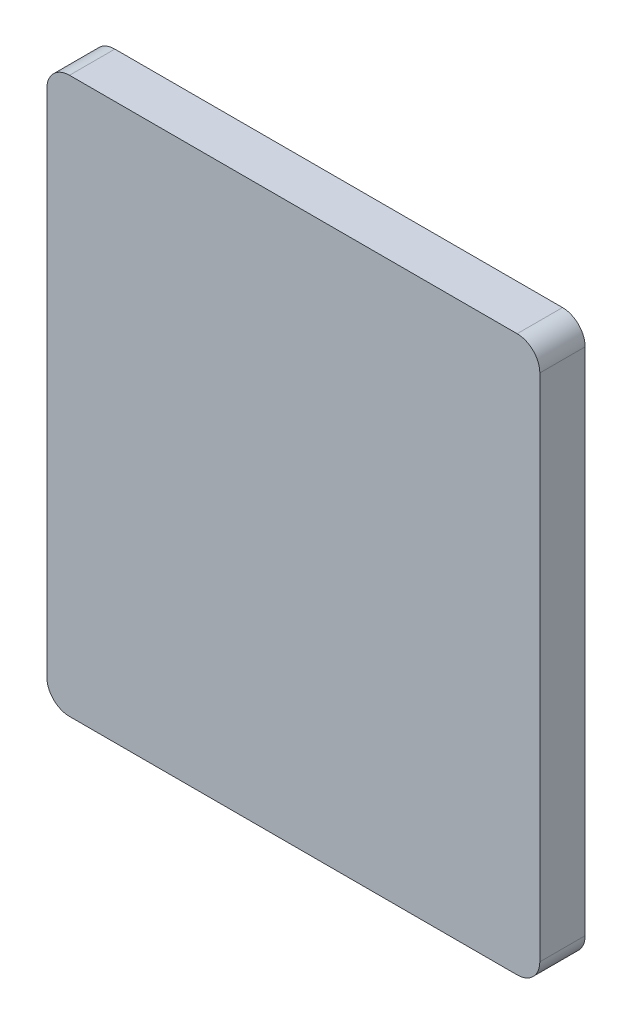
ISO-10303-21;
HEADER;
FILE_DESCRIPTION(('STEP AP214'),'2;1');
FILE_NAME('part.step','',(''),(''),'','','');
FILE_SCHEMA(('AUTOMOTIVE_DESIGN { 1 0 10303 214 1 1 1 1 }'));
ENDSEC;
DATA;
#1=APPLICATION_CONTEXT('core data for automotive mechanical design processes');
#2=APPLICATION_PROTOCOL_DEFINITION('international standard','automotive_design',2000,#1);
#3=PRODUCT_CONTEXT('',#1,'mechanical');
#4=PRODUCT('Part','Part','',(#3));
#5=PRODUCT_RELATED_PRODUCT_CATEGORY('part','',(#4));
#6=PRODUCT_DEFINITION_FORMATION('','',#4);
#7=PRODUCT_DEFINITION_CONTEXT('part definition',#1,'design');
#8=PRODUCT_DEFINITION('design','',#6,#7);
#9=PRODUCT_DEFINITION_SHAPE('','',#8);
#10=(LENGTH_UNIT() NAMED_UNIT(*) SI_UNIT(.MILLI.,.METRE.));
#11=(NAMED_UNIT(*) PLANE_ANGLE_UNIT() SI_UNIT($,.RADIAN.));
#12=(NAMED_UNIT(*) SI_UNIT($,.STERADIAN.) SOLID_ANGLE_UNIT());
#13=UNCERTAINTY_MEASURE_WITH_UNIT(LENGTH_MEASURE(1.E-05),#10,'distance_accuracy_value','');
#14=(GEOMETRIC_REPRESENTATION_CONTEXT(3) GLOBAL_UNCERTAINTY_ASSIGNED_CONTEXT((#13)) GLOBAL_UNIT_ASSIGNED_CONTEXT((#10,
#11,#12)) REPRESENTATION_CONTEXT('',''));
#15=CARTESIAN_POINT('',(0.,0.,0.));
#16=DIRECTION('',(0.,0.,1.));
#17=DIRECTION('',(1.,0.,0.));
#18=AXIS2_PLACEMENT_3D('',#15,#16,#17);
#19=CARTESIAN_POINT('',(39.5,45.,8.));
#20=DIRECTION('',(0.,0.,-1.));
#21=DIRECTION('',(-1.,0.,0.));
#22=AXIS2_PLACEMENT_3D('',#19,#20,#21);
#23=CYLINDRICAL_SURFACE('',#22,4.);
#24=CARTESIAN_POINT('',(39.5,45.,0.));
#25=DIRECTION('',(0.,0.,1.));
#26=DIRECTION('',(1.,0.,0.));
#27=AXIS2_PLACEMENT_3D('',#24,#25,#26);
#28=CIRCLE('',#27,4.);
#29=CARTESIAN_POINT('',(43.5,45.,0.));
#30=VERTEX_POINT('',#29);
#31=CARTESIAN_POINT('',(39.5,49.,0.));
#32=VERTEX_POINT('',#31);
#33=EDGE_CURVE('E128',#30,#32,#28,.T.);
#34=ORIENTED_EDGE('',*,*,#33,.T.);
#35=DIRECTION('',(0.,0.,-1.));
#36=VECTOR('',#35,1.);
#37=CARTESIAN_POINT('',(39.5,49.,8.));
#38=LINE('',#37,#36);
#39=CARTESIAN_POINT('',(39.5,49.,8.));
#40=VERTEX_POINT('',#39);
#41=EDGE_CURVE('E11',#40,#32,#38,.T.);
#42=ORIENTED_EDGE('',*,*,#41,.F.);
#43=CARTESIAN_POINT('',(39.5,45.,8.));
#44=DIRECTION('',(0.,0.,1.));
#45=DIRECTION('',(1.,0.,0.));
#46=AXIS2_PLACEMENT_3D('',#43,#44,#45);
#47=CIRCLE('',#46,4.);
#48=CARTESIAN_POINT('',(43.5,45.,8.));
#49=VERTEX_POINT('',#48);
#50=EDGE_CURVE('E142',#49,#40,#47,.T.);
#51=ORIENTED_EDGE('',*,*,#50,.F.);
#52=DIRECTION('',(0.,0.,-1.));
#53=VECTOR('',#52,1.);
#54=CARTESIAN_POINT('',(43.5,45.,8.));
#55=LINE('',#54,#53);
#56=EDGE_CURVE('E124',#49,#30,#55,.T.);
#57=ORIENTED_EDGE('',*,*,#56,.T.);
#58=EDGE_LOOP('',(#34,#42,#51,#57));
#59=FACE_BOUND('',#58,.T.);
#60=ADVANCED_FACE('F32',(#59),#23,.T.);
#61=CARTESIAN_POINT('',(39.5,49.,8.));
#62=DIRECTION('',(0.,-1.,0.));
#63=DIRECTION('',(1.,0.,0.));
#64=AXIS2_PLACEMENT_3D('',#61,#62,#63);
#65=PLANE('',#64);
#66=DIRECTION('',(-1.,0.,0.));
#67=VECTOR('',#66,1.);
#68=CARTESIAN_POINT('',(39.5,49.,0.));
#69=LINE('',#68,#67);
#70=CARTESIAN_POINT('',(-39.5,49.,0.));
#71=VERTEX_POINT('',#70);
#72=EDGE_CURVE('E131',#32,#71,#69,.T.);
#73=ORIENTED_EDGE('',*,*,#72,.T.);
#74=DIRECTION('',(0.,0.,-1.));
#75=VECTOR('',#74,1.);
#76=CARTESIAN_POINT('',(-39.5,49.,8.));
#77=LINE('',#76,#75);
#78=CARTESIAN_POINT('',(-39.5,49.,8.));
#79=VERTEX_POINT('',#78);
#80=EDGE_CURVE('E40',#79,#71,#77,.T.);
#81=ORIENTED_EDGE('',*,*,#80,.F.);
#82=DIRECTION('',(-1.,0.,0.));
#83=VECTOR('',#82,1.);
#84=CARTESIAN_POINT('',(39.5,49.,8.));
#85=LINE('',#84,#83);
#86=EDGE_CURVE('E91',#40,#79,#85,.T.);
#87=ORIENTED_EDGE('',*,*,#86,.F.);
#88=ORIENTED_EDGE('',*,*,#41,.T.);
#89=EDGE_LOOP('',(#73,#81,#87,#88));
#90=FACE_BOUND('',#89,.T.);
#91=ADVANCED_FACE('F177',(#90),#65,.F.);
#92=CARTESIAN_POINT('',(-39.5,45.,8.));
#93=DIRECTION('',(0.,0.,-1.));
#94=DIRECTION('',(-1.,0.,0.));
#95=AXIS2_PLACEMENT_3D('',#92,#93,#94);
#96=CYLINDRICAL_SURFACE('',#95,4.);
#97=CARTESIAN_POINT('',(-39.5,45.,0.));
#98=DIRECTION('',(0.,0.,1.));
#99=DIRECTION('',(-1.,0.,0.));
#100=AXIS2_PLACEMENT_3D('',#97,#98,#99);
#101=CIRCLE('',#100,4.);
#102=CARTESIAN_POINT('',(-43.5,45.,0.));
#103=VERTEX_POINT('',#102);
#104=EDGE_CURVE('E133',#71,#103,#101,.T.);
#105=ORIENTED_EDGE('',*,*,#104,.T.);
#106=DIRECTION('',(0.,0.,-1.));
#107=VECTOR('',#106,1.);
#108=CARTESIAN_POINT('',(-43.5,45.,8.));
#109=LINE('',#108,#107);
#110=CARTESIAN_POINT('',(-43.5,45.,8.));
#111=VERTEX_POINT('',#110);
#112=EDGE_CURVE('E149',#111,#103,#109,.T.);
#113=ORIENTED_EDGE('',*,*,#112,.F.);
#114=CARTESIAN_POINT('',(-39.5,45.,8.));
#115=DIRECTION('',(0.,0.,1.));
#116=DIRECTION('',(-1.,0.,0.));
#117=AXIS2_PLACEMENT_3D('',#114,#115,#116);
#118=CIRCLE('',#117,4.);
#119=EDGE_CURVE('E157',#79,#111,#118,.T.);
#120=ORIENTED_EDGE('',*,*,#119,.F.);
#121=ORIENTED_EDGE('',*,*,#80,.T.);
#122=EDGE_LOOP('',(#105,#113,#120,#121));
#123=FACE_BOUND('',#122,.T.);
#124=ADVANCED_FACE('F155',(#123),#96,.T.);
#125=CARTESIAN_POINT('',(-43.5,-45.,8.));
#126=DIRECTION('',(1.,0.,0.));
#127=DIRECTION('',(0.,0.,-1.));
#128=AXIS2_PLACEMENT_3D('',#125,#126,#127);
#129=PLANE('',#128);
#130=DIRECTION('',(0.,-1.,0.));
#131=VECTOR('',#130,1.);
#132=CARTESIAN_POINT('',(-43.5,-45.,0.));
#133=LINE('',#132,#131);
#134=CARTESIAN_POINT('',(-43.5,-45.,0.));
#135=VERTEX_POINT('',#134);
#136=EDGE_CURVE('E135',#103,#135,#133,.T.);
#137=ORIENTED_EDGE('',*,*,#136,.T.);
#138=DIRECTION('',(0.,0.,-1.));
#139=VECTOR('',#138,1.);
#140=CARTESIAN_POINT('',(-43.5,-45.,8.));
#141=LINE('',#140,#139);
#142=CARTESIAN_POINT('',(-43.5,-45.,8.));
#143=VERTEX_POINT('',#142);
#144=EDGE_CURVE('E146',#143,#135,#141,.T.);
#145=ORIENTED_EDGE('',*,*,#144,.F.);
#146=DIRECTION('',(0.,-1.,0.));
#147=VECTOR('',#146,1.);
#148=CARTESIAN_POINT('',(-43.5,-45.,8.));
#149=LINE('',#148,#147);
#150=EDGE_CURVE('E169',#111,#143,#149,.T.);
#151=ORIENTED_EDGE('',*,*,#150,.F.);
#152=ORIENTED_EDGE('',*,*,#112,.T.);
#153=EDGE_LOOP('',(#137,#145,#151,#152));
#154=FACE_BOUND('',#153,.T.);
#155=ADVANCED_FACE('F165',(#154),#129,.F.);
#156=CARTESIAN_POINT('',(-39.5,-45.,8.));
#157=DIRECTION('',(0.,0.,-1.));
#158=DIRECTION('',(-1.,0.,0.));
#159=AXIS2_PLACEMENT_3D('',#156,#157,#158);
#160=CYLINDRICAL_SURFACE('',#159,4.);
#161=CARTESIAN_POINT('',(-39.5,-45.,0.));
#162=DIRECTION('',(0.,0.,1.));
#163=DIRECTION('',(1.,0.,0.));
#164=AXIS2_PLACEMENT_3D('',#161,#162,#163);
#165=CIRCLE('',#164,4.);
#166=CARTESIAN_POINT('',(-39.5,-49.,0.));
#167=VERTEX_POINT('',#166);
#168=EDGE_CURVE('E137',#135,#167,#165,.T.);
#169=ORIENTED_EDGE('',*,*,#168,.T.);
#170=DIRECTION('',(0.,0.,-1.));
#171=VECTOR('',#170,1.);
#172=CARTESIAN_POINT('',(-39.5,-49.,8.));
#173=LINE('',#172,#171);
#174=CARTESIAN_POINT('',(-39.5,-49.,8.));
#175=VERTEX_POINT('',#174);
#176=EDGE_CURVE('E119',#175,#167,#173,.T.);
#177=ORIENTED_EDGE('',*,*,#176,.F.);
#178=CARTESIAN_POINT('',(-39.5,-45.,8.));
#179=DIRECTION('',(0.,0.,1.));
#180=DIRECTION('',(1.,0.,0.));
#181=AXIS2_PLACEMENT_3D('',#178,#179,#180);
#182=CIRCLE('',#181,4.);
#183=EDGE_CURVE('E110',#143,#175,#182,.T.);
#184=ORIENTED_EDGE('',*,*,#183,.F.);
#185=ORIENTED_EDGE('',*,*,#144,.T.);
#186=EDGE_LOOP('',(#169,#177,#184,#185));
#187=FACE_BOUND('',#186,.T.);
#188=ADVANCED_FACE('F168',(#187),#160,.T.);
#189=CARTESIAN_POINT('',(39.5,-49.,8.));
#190=DIRECTION('',(0.,1.,0.));
#191=DIRECTION('',(-1.,0.,0.));
#192=AXIS2_PLACEMENT_3D('',#189,#190,#191);
#193=PLANE('',#192);
#194=DIRECTION('',(1.,0.,0.));
#195=VECTOR('',#194,1.);
#196=CARTESIAN_POINT('',(39.5,-49.,0.));
#197=LINE('',#196,#195);
#198=CARTESIAN_POINT('',(39.5,-49.,0.));
#199=VERTEX_POINT('',#198);
#200=EDGE_CURVE('E118',#167,#199,#197,.T.);
#201=ORIENTED_EDGE('',*,*,#200,.T.);
#202=DIRECTION('',(0.,0.,-1.));
#203=VECTOR('',#202,1.);
#204=CARTESIAN_POINT('',(39.5,-49.,8.));
#205=LINE('',#204,#203);
#206=CARTESIAN_POINT('',(39.5,-49.,8.));
#207=VERTEX_POINT('',#206);
#208=EDGE_CURVE('E115',#207,#199,#205,.T.);
#209=ORIENTED_EDGE('',*,*,#208,.F.);
#210=DIRECTION('',(1.,0.,0.));
#211=VECTOR('',#210,1.);
#212=CARTESIAN_POINT('',(39.5,-49.,8.));
#213=LINE('',#212,#211);
#214=EDGE_CURVE('E104',#175,#207,#213,.T.);
#215=ORIENTED_EDGE('',*,*,#214,.F.);
#216=ORIENTED_EDGE('',*,*,#176,.T.);
#217=EDGE_LOOP('',(#201,#209,#215,#216));
#218=FACE_BOUND('',#217,.T.);
#219=ADVANCED_FACE('F116',(#218),#193,.F.);
#220=CARTESIAN_POINT('',(39.5,-45.,8.));
#221=DIRECTION('',(0.,0.,-1.));
#222=DIRECTION('',(-1.,0.,0.));
#223=AXIS2_PLACEMENT_3D('',#220,#221,#222);
#224=CYLINDRICAL_SURFACE('',#223,4.);
#225=CARTESIAN_POINT('',(39.5,-45.,0.));
#226=DIRECTION('',(0.,0.,1.));
#227=DIRECTION('',(-1.,0.,0.));
#228=AXIS2_PLACEMENT_3D('',#225,#226,#227);
#229=CIRCLE('',#228,4.);
#230=CARTESIAN_POINT('',(43.5,-45.,0.));
#231=VERTEX_POINT('',#230);
#232=EDGE_CURVE('E77',#199,#231,#229,.T.);
#233=ORIENTED_EDGE('',*,*,#232,.T.);
#234=DIRECTION('',(0.,0.,-1.));
#235=VECTOR('',#234,1.);
#236=CARTESIAN_POINT('',(43.5,-45.,8.));
#237=LINE('',#236,#235);
#238=CARTESIAN_POINT('',(43.5,-45.,8.));
#239=VERTEX_POINT('',#238);
#240=EDGE_CURVE('E120',#239,#231,#237,.T.);
#241=ORIENTED_EDGE('',*,*,#240,.F.);
#242=CARTESIAN_POINT('',(39.5,-45.,8.));
#243=DIRECTION('',(0.,0.,1.));
#244=DIRECTION('',(-1.,0.,0.));
#245=AXIS2_PLACEMENT_3D('',#242,#243,#244);
#246=CIRCLE('',#245,4.);
#247=EDGE_CURVE('E108',#207,#239,#246,.T.);
#248=ORIENTED_EDGE('',*,*,#247,.F.);
#249=ORIENTED_EDGE('',*,*,#208,.T.);
#250=EDGE_LOOP('',(#233,#241,#248,#249));
#251=FACE_BOUND('',#250,.T.);
#252=ADVANCED_FACE('F122',(#251),#224,.T.);
#253=CARTESIAN_POINT('',(43.5,-45.,8.));
#254=DIRECTION('',(-1.,0.,0.));
#255=DIRECTION('',(0.,0.,1.));
#256=AXIS2_PLACEMENT_3D('',#253,#254,#255);
#257=PLANE('',#256);
#258=DIRECTION('',(0.,1.,0.));
#259=VECTOR('',#258,1.);
#260=CARTESIAN_POINT('',(43.5,-45.,0.));
#261=LINE('',#260,#259);
#262=EDGE_CURVE('E83',#231,#30,#261,.T.);
#263=ORIENTED_EDGE('',*,*,#262,.T.);
#264=ORIENTED_EDGE('',*,*,#56,.F.);
#265=DIRECTION('',(0.,1.,0.));
#266=VECTOR('',#265,1.);
#267=CARTESIAN_POINT('',(43.5,-45.,8.));
#268=LINE('',#267,#266);
#269=EDGE_CURVE('E48',#239,#49,#268,.T.);
#270=ORIENTED_EDGE('',*,*,#269,.F.);
#271=ORIENTED_EDGE('',*,*,#240,.T.);
#272=EDGE_LOOP('',(#263,#264,#270,#271));
#273=FACE_BOUND('',#272,.T.);
#274=ADVANCED_FACE('F193',(#273),#257,.F.);
#275=CARTESIAN_POINT('',(39.5,45.,8.));
#276=DIRECTION('',(0.,0.,1.));
#277=DIRECTION('',(1.,0.,0.));
#278=AXIS2_PLACEMENT_3D('',#275,#276,#277);
#279=PLANE('',#278);
#280=ORIENTED_EDGE('',*,*,#50,.T.);
#281=ORIENTED_EDGE('',*,*,#86,.T.);
#282=ORIENTED_EDGE('',*,*,#119,.T.);
#283=ORIENTED_EDGE('',*,*,#150,.T.);
#284=ORIENTED_EDGE('',*,*,#183,.T.);
#285=ORIENTED_EDGE('',*,*,#214,.T.);
#286=ORIENTED_EDGE('',*,*,#247,.T.);
#287=ORIENTED_EDGE('',*,*,#269,.T.);
#288=EDGE_LOOP('',(#280,#281,#282,#283,#284,#285,#286,#287));
#289=FACE_BOUND('',#288,.T.);
#290=ADVANCED_FACE('F106',(#289),#279,.T.);
#291=CARTESIAN_POINT('',(39.5,45.,0.));
#292=DIRECTION('',(0.,0.,1.));
#293=DIRECTION('',(1.,0.,0.));
#294=AXIS2_PLACEMENT_3D('',#291,#292,#293);
#295=PLANE('',#294);
#296=ORIENTED_EDGE('',*,*,#33,.F.);
#297=ORIENTED_EDGE('',*,*,#262,.F.);
#298=ORIENTED_EDGE('',*,*,#232,.F.);
#299=ORIENTED_EDGE('',*,*,#200,.F.);
#300=ORIENTED_EDGE('',*,*,#168,.F.);
#301=ORIENTED_EDGE('',*,*,#136,.F.);
#302=ORIENTED_EDGE('',*,*,#104,.F.);
#303=ORIENTED_EDGE('',*,*,#72,.F.);
#304=EDGE_LOOP('',(#296,#297,#298,#299,#300,#301,#302,#303));
#305=FACE_BOUND('',#304,.T.);
#306=ADVANCED_FACE('F161',(#305),#295,.F.);
#307=CLOSED_SHELL('',(#60,#91,#124,#155,#188,#219,#252,#274,#290,#306));
#308=MANIFOLD_SOLID_BREP('B2',#307);
#309=ADVANCED_BREP_SHAPE_REPRESENTATION('',(#18,#308),#14);
#310=SHAPE_DEFINITION_REPRESENTATION(#9,#309);
ENDSEC;
END-ISO-10303-21;
